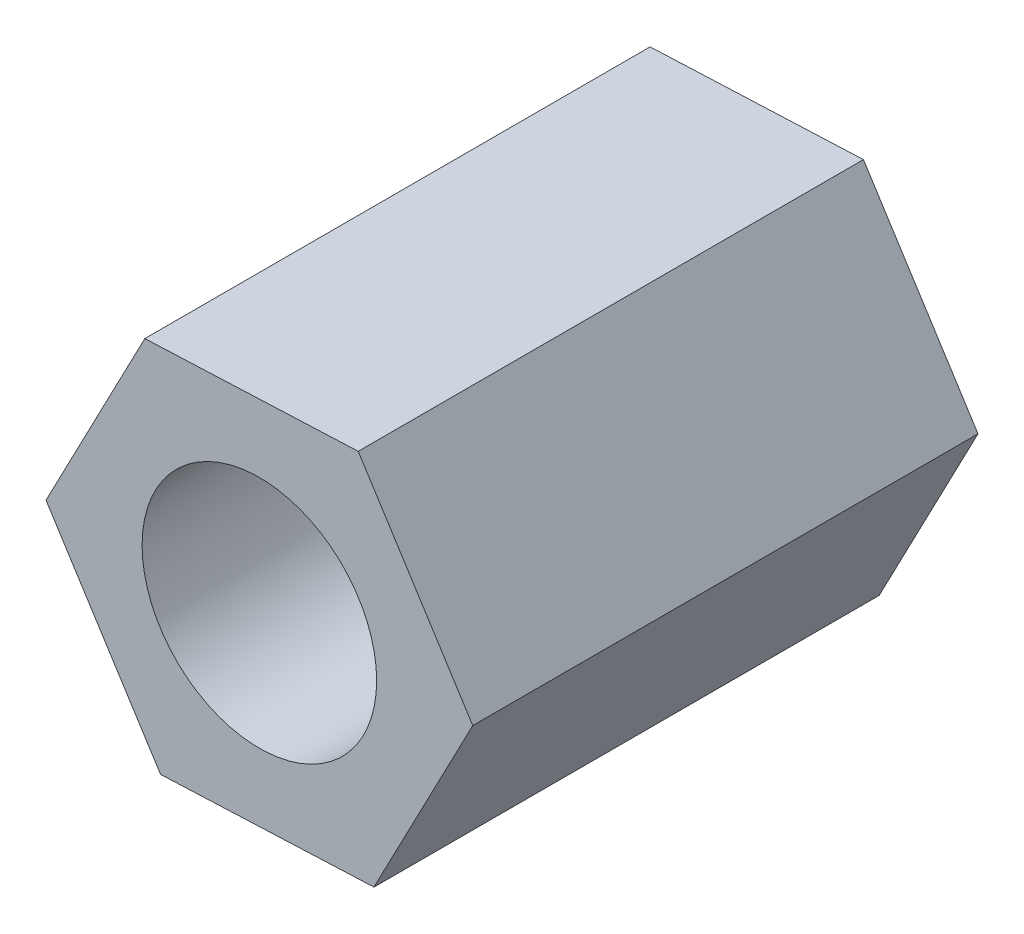
ISO-10303-21;
HEADER;
FILE_DESCRIPTION(('STEP AP214'),'2;1');
FILE_NAME('part.step','',(''),(''),'','','');
FILE_SCHEMA(('AUTOMOTIVE_DESIGN { 1 0 10303 214 1 1 1 1 }'));
ENDSEC;
DATA;
#1=APPLICATION_CONTEXT('core data for automotive mechanical design processes');
#2=APPLICATION_PROTOCOL_DEFINITION('international standard','automotive_design',2000,#1);
#3=PRODUCT_CONTEXT('',#1,'mechanical');
#4=PRODUCT('Part','Part','',(#3));
#5=PRODUCT_RELATED_PRODUCT_CATEGORY('part','',(#4));
#6=PRODUCT_DEFINITION_FORMATION('','',#4);
#7=PRODUCT_DEFINITION_CONTEXT('part definition',#1,'design');
#8=PRODUCT_DEFINITION('design','',#6,#7);
#9=PRODUCT_DEFINITION_SHAPE('','',#8);
#10=(LENGTH_UNIT() NAMED_UNIT(*) SI_UNIT(.MILLI.,.METRE.));
#11=(NAMED_UNIT(*) PLANE_ANGLE_UNIT() SI_UNIT($,.RADIAN.));
#12=(NAMED_UNIT(*) SI_UNIT($,.STERADIAN.) SOLID_ANGLE_UNIT());
#13=UNCERTAINTY_MEASURE_WITH_UNIT(LENGTH_MEASURE(1.E-05),#10,'distance_accuracy_value','');
#14=(GEOMETRIC_REPRESENTATION_CONTEXT(3) GLOBAL_UNCERTAINTY_ASSIGNED_CONTEXT((#13)) GLOBAL_UNIT_ASSIGNED_CONTEXT((#10,
#11,#12)) REPRESENTATION_CONTEXT('',''));
#15=CARTESIAN_POINT('',(0.,0.,0.));
#16=DIRECTION('',(0.,0.,1.));
#17=DIRECTION('',(1.,0.,0.));
#18=AXIS2_PLACEMENT_3D('',#15,#16,#17);
#19=CARTESIAN_POINT('',(10.9542962616372,20.9842018372301,56.));
#20=DIRECTION('',(0.0424733530908673,-0.999097599975707,0.));
#21=DIRECTION('',(0.999097599975707,0.0424733530908673,0.));
#22=AXIS2_PLACEMENT_3D('',#19,#20,#21);
#23=PLANE('',#22);
#24=DIRECTION('',(-0.999097599975707,-0.0424733530908673,0.));
#25=VECTOR('',#24,1.);
#26=CARTESIAN_POINT('',(10.9542962616372,20.9842018372301,0.));
#27=LINE('',#26,#25);
#28=CARTESIAN_POINT('',(10.9542962616372,20.9842018372301,0.));
#29=VERTEX_POINT('',#28);
#30=CARTESIAN_POINT('',(-12.6957037383628,19.9787997617738,0.));
#31=VERTEX_POINT('',#30);
#32=EDGE_CURVE('E120',#29,#31,#27,.T.);
#33=ORIENTED_EDGE('',*,*,#32,.T.);
#34=DIRECTION('',(0.,0.,-1.));
#35=VECTOR('',#34,1.);
#36=CARTESIAN_POINT('',(-12.6957037383628,19.9787997617738,56.));
#37=LINE('',#36,#35);
#38=CARTESIAN_POINT('',(-12.6957037383628,19.9787997617738,56.));
#39=VERTEX_POINT('',#38);
#40=EDGE_CURVE('E11',#39,#31,#37,.T.);
#41=ORIENTED_EDGE('',*,*,#40,.F.);
#42=DIRECTION('',(-0.999097599975707,-0.0424733530908673,0.));
#43=VECTOR('',#42,1.);
#44=CARTESIAN_POINT('',(10.9542962616372,20.9842018372301,56.));
#45=LINE('',#44,#43);
#46=CARTESIAN_POINT('',(10.9542962616372,20.9842018372301,56.));
#47=VERTEX_POINT('',#46);
#48=EDGE_CURVE('E131',#47,#39,#45,.T.);
#49=ORIENTED_EDGE('',*,*,#48,.F.);
#50=DIRECTION('',(0.,0.,-1.));
#51=VECTOR('',#50,1.);
#52=CARTESIAN_POINT('',(10.9542962616372,20.9842018372301,56.));
#53=LINE('',#52,#51);
#54=EDGE_CURVE('E116',#47,#29,#53,.T.);
#55=ORIENTED_EDGE('',*,*,#54,.T.);
#56=EDGE_LOOP('',(#33,#41,#49,#55));
#57=FACE_BOUND('',#56,.T.);
#58=ADVANCED_FACE('F36',(#57),#23,.F.);
#59=CARTESIAN_POINT('',(-12.6957037383628,19.9787997617738,56.));
#60=DIRECTION('',(0.886480578984459,-0.462765797227256,0.));
#61=DIRECTION('',(0.462765797227256,0.886480578984459,0.));
#62=AXIS2_PLACEMENT_3D('',#59,#60,#61);
#63=PLANE('',#62);
#64=DIRECTION('',(-0.462765797227256,-0.886480578984459,0.));
#65=VECTOR('',#64,1.);
#66=CARTESIAN_POINT('',(-12.6957037383628,19.9787997617738,0.));
#67=LINE('',#66,#65);
#68=CARTESIAN_POINT('',(-23.65,-1.00540207545632,0.));
#69=VERTEX_POINT('',#68);
#70=EDGE_CURVE('E123',#31,#69,#67,.T.);
#71=ORIENTED_EDGE('',*,*,#70,.T.);
#72=DIRECTION('',(0.,0.,-1.));
#73=VECTOR('',#72,1.);
#74=CARTESIAN_POINT('',(-23.65,-1.00540207545632,56.));
#75=LINE('',#74,#73);
#76=CARTESIAN_POINT('',(-23.65,-1.00540207545632,56.));
#77=VERTEX_POINT('',#76);
#78=EDGE_CURVE('E44',#77,#69,#75,.T.);
#79=ORIENTED_EDGE('',*,*,#78,.F.);
#80=DIRECTION('',(-0.462765797227256,-0.886480578984459,0.));
#81=VECTOR('',#80,1.);
#82=CARTESIAN_POINT('',(-12.6957037383628,19.9787997617738,56.));
#83=LINE('',#82,#81);
#84=EDGE_CURVE('E89',#39,#77,#83,.T.);
#85=ORIENTED_EDGE('',*,*,#84,.F.);
#86=ORIENTED_EDGE('',*,*,#40,.T.);
#87=EDGE_LOOP('',(#71,#79,#85,#86));
#88=FACE_BOUND('',#87,.T.);
#89=ADVANCED_FACE('F156',(#88),#63,.F.);
#90=CARTESIAN_POINT('',(-23.65,-1.00540207545632,56.));
#91=DIRECTION('',(0.844007225893592,0.536331802748451,0.));
#92=DIRECTION('',(-0.536331802748451,0.844007225893592,0.));
#93=AXIS2_PLACEMENT_3D('',#90,#91,#92);
#94=PLANE('',#93);
#95=DIRECTION('',(0.536331802748451,-0.844007225893592,0.));
#96=VECTOR('',#95,1.);
#97=CARTESIAN_POINT('',(-23.65,-1.00540207545632,0.));
#98=LINE('',#97,#96);
#99=CARTESIAN_POINT('',(-10.9542962616372,-20.9842018372301,0.));
#100=VERTEX_POINT('',#99);
#101=EDGE_CURVE('E126',#69,#100,#98,.T.);
#102=ORIENTED_EDGE('',*,*,#101,.T.);
#103=DIRECTION('',(0.,0.,-1.));
#104=VECTOR('',#103,1.);
#105=CARTESIAN_POINT('',(-10.9542962616372,-20.9842018372301,56.));
#106=LINE('',#105,#104);
#107=CARTESIAN_POINT('',(-10.9542962616372,-20.9842018372301,56.));
#108=VERTEX_POINT('',#107);
#109=EDGE_CURVE('E111',#108,#100,#106,.T.);
#110=ORIENTED_EDGE('',*,*,#109,.F.);
#111=DIRECTION('',(0.536331802748451,-0.844007225893592,0.));
#112=VECTOR('',#111,1.);
#113=CARTESIAN_POINT('',(-23.65,-1.00540207545632,56.));
#114=LINE('',#113,#112);
#115=EDGE_CURVE('E102',#77,#108,#114,.T.);
#116=ORIENTED_EDGE('',*,*,#115,.F.);
#117=ORIENTED_EDGE('',*,*,#78,.T.);
#118=EDGE_LOOP('',(#102,#110,#116,#117));
#119=FACE_BOUND('',#118,.T.);
#120=ADVANCED_FACE('F137',(#119),#94,.F.);
#121=CARTESIAN_POINT('',(-10.9542962616372,-20.9842018372301,56.));
#122=DIRECTION('',(-0.0424733530908675,0.999097599975707,0.));
#123=DIRECTION('',(-0.999097599975707,-0.0424733530908675,0.));
#124=AXIS2_PLACEMENT_3D('',#121,#122,#123);
#125=PLANE('',#124);
#126=DIRECTION('',(0.999097599975707,0.0424733530908675,0.));
#127=VECTOR('',#126,1.);
#128=CARTESIAN_POINT('',(-10.9542962616372,-20.9842018372301,0.));
#129=LINE('',#128,#127);
#130=CARTESIAN_POINT('',(12.6957037383628,-19.9787997617738,0.));
#131=VERTEX_POINT('',#130);
#132=EDGE_CURVE('E110',#100,#131,#129,.T.);
#133=ORIENTED_EDGE('',*,*,#132,.T.);
#134=DIRECTION('',(0.,0.,-1.));
#135=VECTOR('',#134,1.);
#136=CARTESIAN_POINT('',(12.6957037383628,-19.9787997617738,56.));
#137=LINE('',#136,#135);
#138=CARTESIAN_POINT('',(12.6957037383628,-19.9787997617738,56.));
#139=VERTEX_POINT('',#138);
#140=EDGE_CURVE('E107',#139,#131,#137,.T.);
#141=ORIENTED_EDGE('',*,*,#140,.F.);
#142=DIRECTION('',(0.999097599975707,0.0424733530908675,0.));
#143=VECTOR('',#142,1.);
#144=CARTESIAN_POINT('',(-10.9542962616372,-20.9842018372301,56.));
#145=LINE('',#144,#143);
#146=EDGE_CURVE('E96',#108,#139,#145,.T.);
#147=ORIENTED_EDGE('',*,*,#146,.F.);
#148=ORIENTED_EDGE('',*,*,#109,.T.);
#149=EDGE_LOOP('',(#133,#141,#147,#148));
#150=FACE_BOUND('',#149,.T.);
#151=ADVANCED_FACE('F108',(#150),#125,.F.);
#152=CARTESIAN_POINT('',(12.6957037383628,-19.9787997617738,56.));
#153=DIRECTION('',(-0.886480578984459,0.462765797227256,0.));
#154=DIRECTION('',(-0.462765797227256,-0.886480578984459,0.));
#155=AXIS2_PLACEMENT_3D('',#152,#153,#154);
#156=PLANE('',#155);
#157=DIRECTION('',(0.462765797227256,0.886480578984459,0.));
#158=VECTOR('',#157,1.);
#159=CARTESIAN_POINT('',(12.6957037383628,-19.9787997617738,0.));
#160=LINE('',#159,#158);
#161=CARTESIAN_POINT('',(23.65,1.00540207545633,0.));
#162=VERTEX_POINT('',#161);
#163=EDGE_CURVE('E75',#131,#162,#160,.T.);
#164=ORIENTED_EDGE('',*,*,#163,.T.);
#165=DIRECTION('',(0.,0.,-1.));
#166=VECTOR('',#165,1.);
#167=CARTESIAN_POINT('',(23.65,1.00540207545633,56.));
#168=LINE('',#167,#166);
#169=CARTESIAN_POINT('',(23.65,1.00540207545633,56.));
#170=VERTEX_POINT('',#169);
#171=EDGE_CURVE('E112',#170,#162,#168,.T.);
#172=ORIENTED_EDGE('',*,*,#171,.F.);
#173=DIRECTION('',(0.462765797227256,0.886480578984459,0.));
#174=VECTOR('',#173,1.);
#175=CARTESIAN_POINT('',(12.6957037383628,-19.9787997617738,56.));
#176=LINE('',#175,#174);
#177=EDGE_CURVE('E100',#139,#170,#176,.T.);
#178=ORIENTED_EDGE('',*,*,#177,.F.);
#179=ORIENTED_EDGE('',*,*,#140,.T.);
#180=EDGE_LOOP('',(#164,#172,#178,#179));
#181=FACE_BOUND('',#180,.T.);
#182=ADVANCED_FACE('F114',(#181),#156,.F.);
#183=CARTESIAN_POINT('',(23.65,1.00540207545633,56.));
#184=DIRECTION('',(-0.844007225893592,-0.536331802748451,0.));
#185=DIRECTION('',(0.536331802748451,-0.844007225893592,0.));
#186=AXIS2_PLACEMENT_3D('',#183,#184,#185);
#187=PLANE('',#186);
#188=DIRECTION('',(-0.536331802748451,0.844007225893592,0.));
#189=VECTOR('',#188,1.);
#190=CARTESIAN_POINT('',(23.65,1.00540207545633,0.));
#191=LINE('',#190,#189);
#192=EDGE_CURVE('E81',#162,#29,#191,.T.);
#193=ORIENTED_EDGE('',*,*,#192,.T.);
#194=ORIENTED_EDGE('',*,*,#54,.F.);
#195=DIRECTION('',(-0.536331802748451,0.844007225893592,0.));
#196=VECTOR('',#195,1.);
#197=CARTESIAN_POINT('',(23.65,1.00540207545633,56.));
#198=LINE('',#197,#196);
#199=EDGE_CURVE('E52',#170,#47,#198,.T.);
#200=ORIENTED_EDGE('',*,*,#199,.F.);
#201=ORIENTED_EDGE('',*,*,#171,.T.);
#202=EDGE_LOOP('',(#193,#194,#200,#201));
#203=FACE_BOUND('',#202,.T.);
#204=ADVANCED_FACE('F144',(#203),#187,.F.);
#205=CARTESIAN_POINT('',(-12.6957037383628,19.9787997617738,56.));
#206=DIRECTION('',(0.,0.,1.));
#207=DIRECTION('',(1.,0.,0.));
#208=AXIS2_PLACEMENT_3D('',#205,#206,#207);
#209=PLANE('',#208);
#210=CARTESIAN_POINT('',(0.,0.,56.));
#211=DIRECTION('',(0.,0.,1.));
#212=DIRECTION('',(1.,0.,0.));
#213=AXIS2_PLACEMENT_3D('',#210,#211,#212);
#214=CIRCLE('',#213,13.);
#215=CARTESIAN_POINT('',(13.,0.,56.));
#216=VERTEX_POINT('',#215);
#217=EDGE_CURVE('E234',#216,#216,#214,.T.);
#218=ORIENTED_EDGE('',*,*,#217,.F.);
#219=EDGE_LOOP('',(#218));
#220=FACE_BOUND('',#219,.T.);
#221=ORIENTED_EDGE('',*,*,#48,.T.);
#222=ORIENTED_EDGE('',*,*,#84,.T.);
#223=ORIENTED_EDGE('',*,*,#115,.T.);
#224=ORIENTED_EDGE('',*,*,#146,.T.);
#225=ORIENTED_EDGE('',*,*,#177,.T.);
#226=ORIENTED_EDGE('',*,*,#199,.T.);
#227=EDGE_LOOP('',(#221,#222,#223,#224,#225,#226));
#228=FACE_BOUND('',#227,.T.);
#229=ADVANCED_FACE('F98',(#220,#228),#209,.T.);
#230=CARTESIAN_POINT('',(-12.6957037383628,19.9787997617738,0.));
#231=DIRECTION('',(0.,0.,1.));
#232=DIRECTION('',(1.,0.,0.));
#233=AXIS2_PLACEMENT_3D('',#230,#231,#232);
#234=PLANE('',#233);
#235=CARTESIAN_POINT('',(0.,0.,0.));
#236=DIRECTION('',(0.,0.,1.));
#237=DIRECTION('',(1.,0.,0.));
#238=AXIS2_PLACEMENT_3D('',#235,#236,#237);
#239=CIRCLE('',#238,11.1);
#240=CARTESIAN_POINT('',(11.1,0.,0.));
#241=VERTEX_POINT('',#240);
#242=EDGE_CURVE('E229',#241,#241,#239,.T.);
#243=ORIENTED_EDGE('',*,*,#242,.T.);
#244=EDGE_LOOP('',(#243));
#245=FACE_BOUND('',#244,.T.);
#246=ORIENTED_EDGE('',*,*,#32,.F.);
#247=ORIENTED_EDGE('',*,*,#192,.F.);
#248=ORIENTED_EDGE('',*,*,#163,.F.);
#249=ORIENTED_EDGE('',*,*,#132,.F.);
#250=ORIENTED_EDGE('',*,*,#101,.F.);
#251=ORIENTED_EDGE('',*,*,#70,.F.);
#252=EDGE_LOOP('',(#246,#247,#248,#249,#250,#251));
#253=FACE_BOUND('',#252,.T.);
#254=ADVANCED_FACE('F140',(#245,#253),#234,.F.);
#255=CARTESIAN_POINT('',(0.,0.,29.));
#256=DIRECTION('',(0.,0.,1.));
#257=DIRECTION('',(1.,0.,0.));
#258=AXIS2_PLACEMENT_3D('',#255,#256,#257);
#259=CYLINDRICAL_SURFACE('',#258,13.);
#260=CARTESIAN_POINT('',(0.,0.,29.));
#261=DIRECTION('',(0.,0.,1.));
#262=DIRECTION('',(1.,0.,0.));
#263=AXIS2_PLACEMENT_3D('',#260,#261,#262);
#264=CIRCLE('',#263,13.);
#265=CARTESIAN_POINT('',(13.,0.,29.));
#266=VERTEX_POINT('',#265);
#267=EDGE_CURVE('E124',#266,#266,#264,.T.);
#268=ORIENTED_EDGE('',*,*,#267,.F.);
#269=EDGE_LOOP('',(#268));
#270=FACE_BOUND('',#269,.T.);
#271=ORIENTED_EDGE('',*,*,#217,.T.);
#272=EDGE_LOOP('',(#271));
#273=FACE_BOUND('',#272,.T.);
#274=ADVANCED_FACE('F191',(#270,#273),#259,.F.);
#275=CARTESIAN_POINT('',(0.,0.,29.));
#276=DIRECTION('',(0.,0.,1.));
#277=DIRECTION('',(1.,0.,0.));
#278=AXIS2_PLACEMENT_3D('',#275,#276,#277);
#279=PLANE('',#278);
#280=CARTESIAN_POINT('',(0.,0.,29.));
#281=DIRECTION('',(0.,0.,1.));
#282=DIRECTION('',(1.,0.,0.));
#283=AXIS2_PLACEMENT_3D('',#280,#281,#282);
#284=CIRCLE('',#283,11.1);
#285=CARTESIAN_POINT('',(11.1,0.,29.));
#286=VERTEX_POINT('',#285);
#287=EDGE_CURVE('E232',#286,#286,#284,.T.);
#288=ORIENTED_EDGE('',*,*,#287,.F.);
#289=EDGE_LOOP('',(#288));
#290=FACE_BOUND('',#289,.T.);
#291=ORIENTED_EDGE('',*,*,#267,.T.);
#292=EDGE_LOOP('',(#291));
#293=FACE_BOUND('',#292,.T.);
#294=ADVANCED_FACE('F196',(#290,#293),#279,.T.);
#295=CARTESIAN_POINT('',(0.,0.,0.));
#296=DIRECTION('',(0.,0.,1.));
#297=DIRECTION('',(1.,0.,0.));
#298=AXIS2_PLACEMENT_3D('',#295,#296,#297);
#299=CYLINDRICAL_SURFACE('',#298,11.1);
#300=CARTESIAN_POINT('',(11.1,0.,0.));
#301=CARTESIAN_POINT('',(11.1,0.,0.302083333333333));
#302=CARTESIAN_POINT('',(11.1,0.,0.604166666666667));
#303=CARTESIAN_POINT('',(11.1,0.,1.20833333333333));
#304=CARTESIAN_POINT('',(11.1,0.,1.51041666666667));
#305=CARTESIAN_POINT('',(11.1,0.,2.11458333333333));
#306=CARTESIAN_POINT('',(11.1,0.,2.41666666666667));
#307=CARTESIAN_POINT('',(11.1,0.,3.02083333333333));
#308=CARTESIAN_POINT('',(11.1,0.,3.32291666666667));
#309=CARTESIAN_POINT('',(11.1,0.,3.92708333333333));
#310=CARTESIAN_POINT('',(11.1,0.,4.22916666666667));
#311=CARTESIAN_POINT('',(11.1,0.,4.83333333333333));
#312=CARTESIAN_POINT('',(11.1,0.,5.13541666666667));
#313=CARTESIAN_POINT('',(11.1,0.,5.73958333333333));
#314=CARTESIAN_POINT('',(11.1,0.,6.04166666666667));
#315=CARTESIAN_POINT('',(11.1,0.,6.64583333333333));
#316=CARTESIAN_POINT('',(11.1,0.,6.94791666666667));
#317=CARTESIAN_POINT('',(11.1,0.,7.55208333333333));
#318=CARTESIAN_POINT('',(11.1,0.,7.85416666666667));
#319=CARTESIAN_POINT('',(11.1,0.,8.45833333333333));
#320=CARTESIAN_POINT('',(11.1,0.,8.76041666666667));
#321=CARTESIAN_POINT('',(11.1,0.,9.36458333333333));
#322=CARTESIAN_POINT('',(11.1,0.,9.66666666666667));
#323=CARTESIAN_POINT('',(11.1,0.,10.2708333333333));
#324=CARTESIAN_POINT('',(11.1,0.,10.5729166666667));
#325=CARTESIAN_POINT('',(11.1,0.,11.1770833333333));
#326=CARTESIAN_POINT('',(11.1,0.,11.4791666666667));
#327=CARTESIAN_POINT('',(11.1,0.,12.0833333333333));
#328=CARTESIAN_POINT('',(11.1,0.,12.3854166666667));
#329=CARTESIAN_POINT('',(11.1,0.,12.9895833333333));
#330=CARTESIAN_POINT('',(11.1,0.,13.2916666666667));
#331=CARTESIAN_POINT('',(11.1,0.,13.8958333333333));
#332=CARTESIAN_POINT('',(11.1,0.,14.1979166666667));
#333=CARTESIAN_POINT('',(11.1,0.,14.8020833333333));
#334=CARTESIAN_POINT('',(11.1,0.,15.1041666666667));
#335=CARTESIAN_POINT('',(11.1,0.,15.7083333333333));
#336=CARTESIAN_POINT('',(11.1,0.,16.0104166666667));
#337=CARTESIAN_POINT('',(11.1,0.,16.6145833333333));
#338=CARTESIAN_POINT('',(11.1,0.,16.9166666666667));
#339=CARTESIAN_POINT('',(11.1,0.,17.5208333333333));
#340=CARTESIAN_POINT('',(11.1,0.,17.8229166666667));
#341=CARTESIAN_POINT('',(11.1,0.,18.4270833333333));
#342=CARTESIAN_POINT('',(11.1,0.,18.7291666666667));
#343=CARTESIAN_POINT('',(11.1,0.,19.3333333333333));
#344=CARTESIAN_POINT('',(11.1,0.,19.6354166666667));
#345=CARTESIAN_POINT('',(11.1,0.,20.2395833333333));
#346=CARTESIAN_POINT('',(11.1,0.,20.5416666666667));
#347=CARTESIAN_POINT('',(11.1,0.,21.1458333333333));
#348=CARTESIAN_POINT('',(11.1,0.,21.4479166666667));
#349=CARTESIAN_POINT('',(11.1,0.,22.0520833333333));
#350=CARTESIAN_POINT('',(11.1,0.,22.3541666666667));
#351=CARTESIAN_POINT('',(11.1,0.,22.9583333333333));
#352=CARTESIAN_POINT('',(11.1,0.,23.2604166666667));
#353=CARTESIAN_POINT('',(11.1,0.,23.8645833333333));
#354=CARTESIAN_POINT('',(11.1,0.,24.1666666666667));
#355=CARTESIAN_POINT('',(11.1,0.,24.7708333333333));
#356=CARTESIAN_POINT('',(11.1,0.,25.0729166666667));
#357=CARTESIAN_POINT('',(11.1,0.,25.6770833333333));
#358=CARTESIAN_POINT('',(11.1,0.,25.9791666666667));
#359=CARTESIAN_POINT('',(11.1,0.,26.5833333333333));
#360=CARTESIAN_POINT('',(11.1,0.,26.8854166666667));
#361=CARTESIAN_POINT('',(11.1,0.,27.4895833333333));
#362=CARTESIAN_POINT('',(11.1,0.,27.7916666666667));
#363=CARTESIAN_POINT('',(11.1,0.,28.3958333333333));
#364=CARTESIAN_POINT('',(11.1,0.,28.6979166666667));
#365=CARTESIAN_POINT('',(11.1,0.,29.));
#366=B_SPLINE_CURVE_WITH_KNOTS('',3,(#300,#301,#302,#303,#304,#305,#306,#307,#308,#309,#310,
#311,#312,#313,#314,#315,#316,#317,#318,#319,#320,#321,#322,#323,#324,#325,#326,#327,#328,#329,
#330,#331,#332,#333,#334,#335,#336,#337,#338,#339,#340,#341,#342,#343,#344,#345,#346,#347,#348,
#349,#350,#351,#352,#353,#354,#355,#356,#357,#358,#359,#360,#361,#362,#363,#364,#365),
.UNSPECIFIED.,.F.,.F.,(4,2,2,2,2,2,2,2,2,2,2,2,2,2,2,2,2,2,2,2,2,2,2,2,2,2,2,2,2,2,2,2,4),(0.,
0.90625,1.8125,2.71875,3.625,4.53125,5.4375,6.34375,7.25,8.15625,9.0625,9.96875,10.875,11.78125,
12.6875,13.59375,14.5,15.40625,16.3125,17.21875,18.125,19.03125,19.9375,20.84375,21.75,22.65625,
23.5625,24.46875,25.375,26.28125,27.1875,28.09375,29.),.UNSPECIFIED.);
#367=EDGE_CURVE('BSEAM212',#241,#286,#366,.T.);
#368=ORIENTED_EDGE('',*,*,#242,.F.);
#369=ORIENTED_EDGE('',*,*,#287,.T.);
#370=ORIENTED_EDGE('',*,*,#367,.T.);
#371=ORIENTED_EDGE('',*,*,#367,.F.);
#372=EDGE_LOOP('',(#368,#370,#369,#371));
#373=FACE_BOUND('',#372,.T.);
#374=ADVANCED_FACE('F212',(#373),#299,.F.);
#375=CLOSED_SHELL('',(#58,#89,#120,#151,#182,#204,#229,#254,#274,#294,#374));
#376=MANIFOLD_SOLID_BREP('B2',#375);
#377=ADVANCED_BREP_SHAPE_REPRESENTATION('',(#18,#376),#14);
#378=SHAPE_DEFINITION_REPRESENTATION(#9,#377);
ENDSEC;
END-ISO-10303-21;
